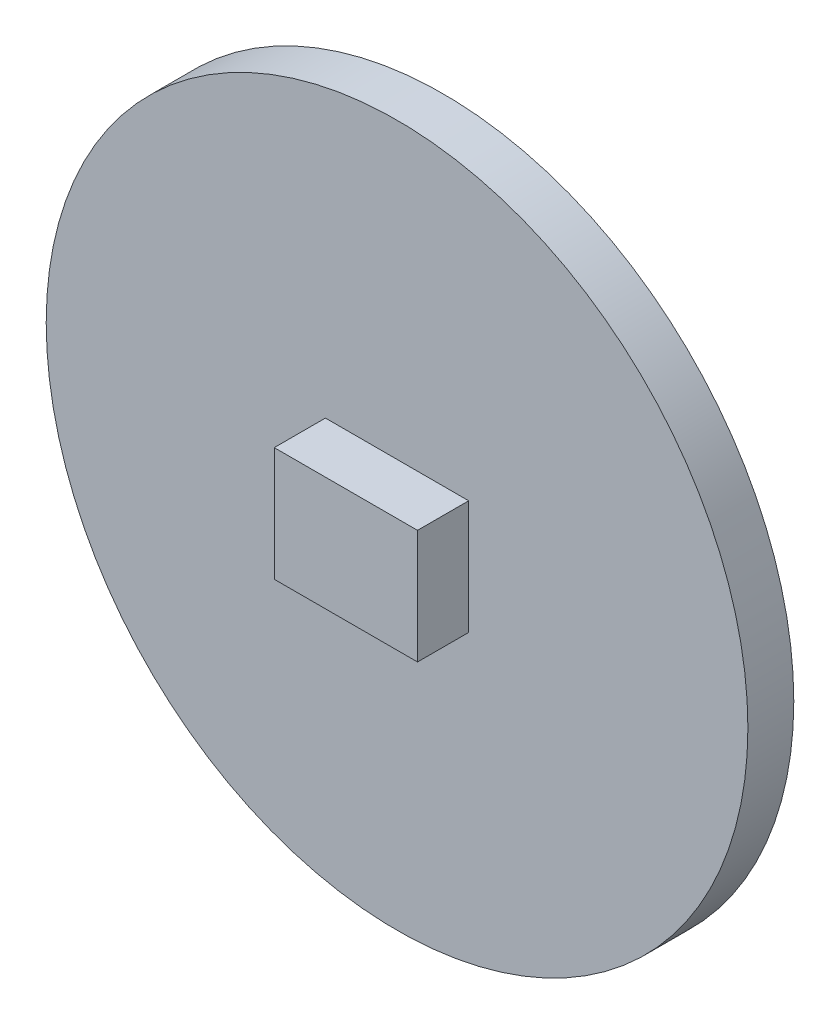
ISO-10303-21;
HEADER;
FILE_DESCRIPTION(('STEP AP214'),'2;1');
FILE_NAME('part.step','',(''),(''),'','','');
FILE_SCHEMA(('AUTOMOTIVE_DESIGN { 1 0 10303 214 1 1 1 1 }'));
ENDSEC;
DATA;
#1=APPLICATION_CONTEXT('core data for automotive mechanical design processes');
#2=APPLICATION_PROTOCOL_DEFINITION('international standard','automotive_design',2000,#1);
#3=PRODUCT_CONTEXT('',#1,'mechanical');
#4=PRODUCT('Part','Part','',(#3));
#5=PRODUCT_RELATED_PRODUCT_CATEGORY('part','',(#4));
#6=PRODUCT_DEFINITION_FORMATION('','',#4);
#7=PRODUCT_DEFINITION_CONTEXT('part definition',#1,'design');
#8=PRODUCT_DEFINITION('design','',#6,#7);
#9=PRODUCT_DEFINITION_SHAPE('','',#8);
#10=(LENGTH_UNIT() NAMED_UNIT(*) SI_UNIT(.MILLI.,.METRE.));
#11=(NAMED_UNIT(*) PLANE_ANGLE_UNIT() SI_UNIT($,.RADIAN.));
#12=(NAMED_UNIT(*) SI_UNIT($,.STERADIAN.) SOLID_ANGLE_UNIT());
#13=UNCERTAINTY_MEASURE_WITH_UNIT(LENGTH_MEASURE(1.E-05),#10,'distance_accuracy_value','');
#14=(GEOMETRIC_REPRESENTATION_CONTEXT(3) GLOBAL_UNCERTAINTY_ASSIGNED_CONTEXT((#13)) GLOBAL_UNIT_ASSIGNED_CONTEXT((#10,
#11,#12)) REPRESENTATION_CONTEXT('',''));
#15=CARTESIAN_POINT('',(0.,0.,0.));
#16=DIRECTION('',(0.,0.,1.));
#17=DIRECTION('',(1.,0.,0.));
#18=AXIS2_PLACEMENT_3D('',#15,#16,#17);
#19=CARTESIAN_POINT('',(0.,0.,1.57));
#20=DIRECTION('',(0.,0.,-1.));
#21=DIRECTION('',(-1.,0.,0.));
#22=AXIS2_PLACEMENT_3D('',#19,#20,#21);
#23=CYLINDRICAL_SURFACE('',#22,12.);
#24=CARTESIAN_POINT('',(0.,0.,1.57));
#25=DIRECTION('',(0.,0.,1.));
#26=DIRECTION('',(1.,0.,0.));
#27=AXIS2_PLACEMENT_3D('',#24,#25,#26);
#28=CIRCLE('',#27,12.);
#29=CARTESIAN_POINT('',(12.,0.,1.57));
#30=VERTEX_POINT('',#29);
#31=EDGE_CURVE('E11',#30,#30,#28,.T.);
#32=ORIENTED_EDGE('',*,*,#31,.F.);
#33=EDGE_LOOP('',(#32));
#34=FACE_BOUND('',#33,.T.);
#35=CARTESIAN_POINT('',(0.,0.,0.));
#36=DIRECTION('',(0.,0.,1.));
#37=DIRECTION('',(1.,0.,0.));
#38=AXIS2_PLACEMENT_3D('',#35,#36,#37);
#39=CIRCLE('',#38,12.);
#40=CARTESIAN_POINT('',(12.,0.,0.));
#41=VERTEX_POINT('',#40);
#42=EDGE_CURVE('E37',#41,#41,#39,.T.);
#43=ORIENTED_EDGE('',*,*,#42,.T.);
#44=EDGE_LOOP('',(#43));
#45=FACE_BOUND('',#44,.T.);
#46=ADVANCED_FACE('F34',(#34,#45),#23,.T.);
#47=CARTESIAN_POINT('',(0.,0.,1.57));
#48=DIRECTION('',(0.,0.,1.));
#49=DIRECTION('',(1.,0.,0.));
#50=AXIS2_PLACEMENT_3D('',#47,#48,#49);
#51=PLANE('',#50);
#52=DIRECTION('',(0.,-1.,0.));
#53=VECTOR('',#52,1.);
#54=CARTESIAN_POINT('',(-2.45,-1.95,1.57));
#55=LINE('',#54,#53);
#56=CARTESIAN_POINT('',(-2.45,1.95,1.57));
#57=VERTEX_POINT('',#56);
#58=CARTESIAN_POINT('',(-2.45,-1.95,1.57));
#59=VERTEX_POINT('',#58);
#60=EDGE_CURVE('E48',#57,#59,#55,.T.);
#61=ORIENTED_EDGE('',*,*,#60,.F.);
#62=DIRECTION('',(-1.,0.,0.));
#63=VECTOR('',#62,1.);
#64=CARTESIAN_POINT('',(2.45,1.95,1.57));
#65=LINE('',#64,#63);
#66=CARTESIAN_POINT('',(2.45,1.95,1.57));
#67=VERTEX_POINT('',#66);
#68=EDGE_CURVE('E52',#67,#57,#65,.T.);
#69=ORIENTED_EDGE('',*,*,#68,.F.);
#70=DIRECTION('',(0.,1.,0.));
#71=VECTOR('',#70,1.);
#72=CARTESIAN_POINT('',(2.45,-1.95,1.57));
#73=LINE('',#72,#71);
#74=CARTESIAN_POINT('',(2.45,-1.95,1.57));
#75=VERTEX_POINT('',#74);
#76=EDGE_CURVE('E104',#75,#67,#73,.T.);
#77=ORIENTED_EDGE('',*,*,#76,.F.);
#78=DIRECTION('',(1.,0.,0.));
#79=VECTOR('',#78,1.);
#80=CARTESIAN_POINT('',(2.45,-1.95,1.57));
#81=LINE('',#80,#79);
#82=EDGE_CURVE('E106',#59,#75,#81,.T.);
#83=ORIENTED_EDGE('',*,*,#82,.F.);
#84=EDGE_LOOP('',(#61,#69,#77,#83));
#85=FACE_BOUND('',#84,.T.);
#86=ORIENTED_EDGE('',*,*,#31,.T.);
#87=EDGE_LOOP('',(#86));
#88=FACE_BOUND('',#87,.T.);
#89=ADVANCED_FACE('F124',(#85,#88),#51,.T.);
#90=CARTESIAN_POINT('',(0.,0.,0.));
#91=DIRECTION('',(0.,0.,1.));
#92=DIRECTION('',(1.,0.,0.));
#93=AXIS2_PLACEMENT_3D('',#90,#91,#92);
#94=PLANE('',#93);
#95=ORIENTED_EDGE('',*,*,#42,.F.);
#96=EDGE_LOOP('',(#95));
#97=FACE_BOUND('',#96,.T.);
#98=ADVANCED_FACE('F129',(#97),#94,.F.);
#99=CARTESIAN_POINT('',(-2.45,-1.95,3.32));
#100=DIRECTION('',(1.,0.,0.));
#101=DIRECTION('',(0.,0.,-1.));
#102=AXIS2_PLACEMENT_3D('',#99,#100,#101);
#103=PLANE('',#102);
#104=ORIENTED_EDGE('',*,*,#60,.T.);
#105=DIRECTION('',(0.,0.,-1.));
#106=VECTOR('',#105,1.);
#107=CARTESIAN_POINT('',(-2.45,-1.95,3.32));
#108=LINE('',#107,#106);
#109=CARTESIAN_POINT('',(-2.45,-1.95,3.32));
#110=VERTEX_POINT('',#109);
#111=EDGE_CURVE('E77',#110,#59,#108,.T.);
#112=ORIENTED_EDGE('',*,*,#111,.F.);
#113=DIRECTION('',(0.,-1.,0.));
#114=VECTOR('',#113,1.);
#115=CARTESIAN_POINT('',(-2.45,-1.95,3.32));
#116=LINE('',#115,#114);
#117=CARTESIAN_POINT('',(-2.45,1.95,3.32));
#118=VERTEX_POINT('',#117);
#119=EDGE_CURVE('E83',#118,#110,#116,.T.);
#120=ORIENTED_EDGE('',*,*,#119,.F.);
#121=DIRECTION('',(0.,0.,-1.));
#122=VECTOR('',#121,1.);
#123=CARTESIAN_POINT('',(-2.45,1.95,3.32));
#124=LINE('',#123,#122);
#125=EDGE_CURVE('E101',#118,#57,#124,.T.);
#126=ORIENTED_EDGE('',*,*,#125,.T.);
#127=EDGE_LOOP('',(#104,#112,#120,#126));
#128=FACE_BOUND('',#127,.T.);
#129=ADVANCED_FACE('F93',(#128),#103,.F.);
#130=CARTESIAN_POINT('',(2.45,-1.95,3.32));
#131=DIRECTION('',(0.,1.,0.));
#132=DIRECTION('',(-1.,0.,0.));
#133=AXIS2_PLACEMENT_3D('',#130,#131,#132);
#134=PLANE('',#133);
#135=ORIENTED_EDGE('',*,*,#82,.T.);
#136=DIRECTION('',(0.,0.,-1.));
#137=VECTOR('',#136,1.);
#138=CARTESIAN_POINT('',(2.45,-1.95,3.32));
#139=LINE('',#138,#137);
#140=CARTESIAN_POINT('',(2.45,-1.95,3.32));
#141=VERTEX_POINT('',#140);
#142=EDGE_CURVE('E79',#141,#75,#139,.T.);
#143=ORIENTED_EDGE('',*,*,#142,.F.);
#144=DIRECTION('',(1.,0.,0.));
#145=VECTOR('',#144,1.);
#146=CARTESIAN_POINT('',(2.45,-1.95,3.32));
#147=LINE('',#146,#145);
#148=EDGE_CURVE('E72',#110,#141,#147,.T.);
#149=ORIENTED_EDGE('',*,*,#148,.F.);
#150=ORIENTED_EDGE('',*,*,#111,.T.);
#151=EDGE_LOOP('',(#135,#143,#149,#150));
#152=FACE_BOUND('',#151,.T.);
#153=ADVANCED_FACE('F75',(#152),#134,.F.);
#154=CARTESIAN_POINT('',(2.45,-1.95,3.32));
#155=DIRECTION('',(-1.,0.,0.));
#156=DIRECTION('',(0.,0.,1.));
#157=AXIS2_PLACEMENT_3D('',#154,#155,#156);
#158=PLANE('',#157);
#159=ORIENTED_EDGE('',*,*,#76,.T.);
#160=DIRECTION('',(0.,0.,-1.));
#161=VECTOR('',#160,1.);
#162=CARTESIAN_POINT('',(2.45,1.95,3.32));
#163=LINE('',#162,#161);
#164=CARTESIAN_POINT('',(2.45,1.95,3.32));
#165=VERTEX_POINT('',#164);
#166=EDGE_CURVE('E96',#165,#67,#163,.T.);
#167=ORIENTED_EDGE('',*,*,#166,.F.);
#168=DIRECTION('',(0.,1.,0.));
#169=VECTOR('',#168,1.);
#170=CARTESIAN_POINT('',(2.45,-1.95,3.32));
#171=LINE('',#170,#169);
#172=EDGE_CURVE('E82',#141,#165,#171,.T.);
#173=ORIENTED_EDGE('',*,*,#172,.F.);
#174=ORIENTED_EDGE('',*,*,#142,.T.);
#175=EDGE_LOOP('',(#159,#167,#173,#174));
#176=FACE_BOUND('',#175,.T.);
#177=ADVANCED_FACE('F112',(#176),#158,.F.);
#178=CARTESIAN_POINT('',(2.45,1.95,3.32));
#179=DIRECTION('',(0.,-1.,0.));
#180=DIRECTION('',(1.,0.,0.));
#181=AXIS2_PLACEMENT_3D('',#178,#179,#180);
#182=PLANE('',#181);
#183=ORIENTED_EDGE('',*,*,#68,.T.);
#184=ORIENTED_EDGE('',*,*,#125,.F.);
#185=DIRECTION('',(-1.,0.,0.));
#186=VECTOR('',#185,1.);
#187=CARTESIAN_POINT('',(2.45,1.95,3.32));
#188=LINE('',#187,#186);
#189=EDGE_CURVE('E88',#165,#118,#188,.T.);
#190=ORIENTED_EDGE('',*,*,#189,.F.);
#191=ORIENTED_EDGE('',*,*,#166,.T.);
#192=EDGE_LOOP('',(#183,#184,#190,#191));
#193=FACE_BOUND('',#192,.T.);
#194=ADVANCED_FACE('F114',(#193),#182,.F.);
#195=CARTESIAN_POINT('',(0.,0.,3.32));
#196=DIRECTION('',(0.,0.,1.));
#197=DIRECTION('',(1.,0.,0.));
#198=AXIS2_PLACEMENT_3D('',#195,#196,#197);
#199=PLANE('',#198);
#200=ORIENTED_EDGE('',*,*,#119,.T.);
#201=ORIENTED_EDGE('',*,*,#148,.T.);
#202=ORIENTED_EDGE('',*,*,#172,.T.);
#203=ORIENTED_EDGE('',*,*,#189,.T.);
#204=EDGE_LOOP('',(#200,#201,#202,#203));
#205=FACE_BOUND('',#204,.T.);
#206=ADVANCED_FACE('F86',(#205),#199,.T.);
#207=CLOSED_SHELL('',(#46,#89,#98,#129,#153,#177,#194,#206));
#208=MANIFOLD_SOLID_BREP('B2',#207);
#209=ADVANCED_BREP_SHAPE_REPRESENTATION('',(#18,#208),#14);
#210=SHAPE_DEFINITION_REPRESENTATION(#9,#209);
ENDSEC;
END-ISO-10303-21;
